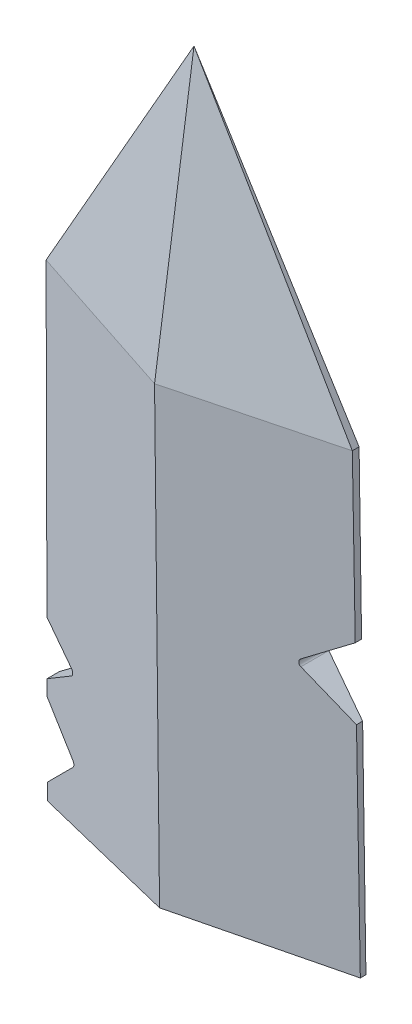
ISO-10303-21;
HEADER;
FILE_DESCRIPTION(('STEP AP214'),'2;1');
FILE_NAME('part.step','',(''),(''),'','','');
FILE_SCHEMA(('AUTOMOTIVE_DESIGN { 1 0 10303 214 1 1 1 1 }'));
ENDSEC;
DATA;
#1=APPLICATION_CONTEXT('core data for automotive mechanical design processes');
#2=APPLICATION_PROTOCOL_DEFINITION('international standard','automotive_design',2000,#1);
#3=PRODUCT_CONTEXT('',#1,'mechanical');
#4=PRODUCT('Part','Part','',(#3));
#5=PRODUCT_RELATED_PRODUCT_CATEGORY('part','',(#4));
#6=PRODUCT_DEFINITION_FORMATION('','',#4);
#7=PRODUCT_DEFINITION_CONTEXT('part definition',#1,'design');
#8=PRODUCT_DEFINITION('design','',#6,#7);
#9=PRODUCT_DEFINITION_SHAPE('','',#8);
#10=(LENGTH_UNIT() NAMED_UNIT(*) SI_UNIT(.MILLI.,.METRE.));
#11=(NAMED_UNIT(*) PLANE_ANGLE_UNIT() SI_UNIT($,.RADIAN.));
#12=(NAMED_UNIT(*) SI_UNIT($,.STERADIAN.) SOLID_ANGLE_UNIT());
#13=UNCERTAINTY_MEASURE_WITH_UNIT(LENGTH_MEASURE(1.E-05),#10,'distance_accuracy_value','');
#14=(GEOMETRIC_REPRESENTATION_CONTEXT(3) GLOBAL_UNCERTAINTY_ASSIGNED_CONTEXT((#13)) GLOBAL_UNIT_ASSIGNED_CONTEXT((#10,
#11,#12)) REPRESENTATION_CONTEXT('',''));
#15=CARTESIAN_POINT('',(0.,0.,0.));
#16=DIRECTION('',(0.,0.,1.));
#17=DIRECTION('',(1.,0.,0.));
#18=AXIS2_PLACEMENT_3D('',#15,#16,#17);
#19=CARTESIAN_POINT('',(49.2246430956603,942.792954579603,0.));
#20=DIRECTION('',(0.238804060374286,0.00264025652948276,0.971064184178478));
#21=DIRECTION('',(0.971067568818316,0.,-0.238804892724763));
#22=AXIS2_PLACEMENT_3D('',#19,#20,#21);
#23=PLANE('',#22);
#24=DIRECTION('',(0.971067568818316,0.,-0.238804892724763));
#25=VECTOR('',#24,1.);
#26=CARTESIAN_POINT('',(49.3765931175051,701.796914098348,0.617884066826339));
#27=LINE('',#26,#25);
#28=CARTESIAN_POINT('',(57.2177665065291,701.796914098348,-1.31041693933411));
#29=VERTEX_POINT('',#28);
#30=CARTESIAN_POINT('',(90.6212496201303,701.796914098348,-9.525));
#31=VERTEX_POINT('',#30);
#32=EDGE_CURVE('E49',#29,#31,#27,.T.);
#33=ORIENTED_EDGE('',*,*,#32,.F.);
#34=DIRECTION('',(0.,0.999996303727557,-0.00271892096670104));
#35=VECTOR('',#34,1.);
#36=CARTESIAN_POINT('',(57.2177665065291,807.125541731836,-1.59679821194385));
#37=LINE('',#36,#35);
#38=CARTESIAN_POINT('',(57.2177665065291,705.432335957503,-1.32030140058543));
#39=VERTEX_POINT('',#38);
#40=EDGE_CURVE('E56',#29,#39,#37,.T.);
#41=ORIENTED_EDGE('',*,*,#40,.T.);
#42=DIRECTION('',(-0.696425219158623,-0.696425219158644,0.173158390613042));
#43=VECTOR('',#42,1.);
#44=CARTESIAN_POINT('',(168.303638707019,816.518208157996,-28.9405689051451));
#45=LINE('',#44,#43);
#46=CARTESIAN_POINT('',(64.8636119693734,713.078181420348,-3.22135589832697));
#47=VERTEX_POINT('',#46);
#48=EDGE_CURVE('E312',#47,#39,#45,.T.);
#49=ORIENTED_EDGE('',*,*,#48,.F.);
#50=CARTESIAN_POINT('',(64.1900927602932,713.751700629428,-3.05755533707624));
#51=DIRECTION('',(0.238804060374286,0.00264025652948276,0.971064184178478));
#52=DIRECTION('',(-0.971004838791762,-0.0107355874174045,0.238818655481073));
#53=AXIS2_PLACEMENT_3D('',#50,#51,#52);
#54=ELLIPSE('',#53,0.980882639396106,0.952500000000012);
#55=CARTESIAN_POINT('',(64.8636119693734,714.425219838508,-3.22501840286267));
#56=VERTEX_POINT('',#55);
#57=EDGE_CURVE('E307',#56,#47,#54,.F.);
#58=ORIENTED_EDGE('',*,*,#57,.F.);
#59=DIRECTION('',(0.696877354228562,-0.696877354228535,-0.169481286066742));
#60=VECTOR('',#59,1.);
#61=CARTESIAN_POINT('',(-54.0162263991512,833.305058207028,25.6866800069781));
#62=LINE('',#61,#60);
#63=CARTESIAN_POINT('',(57.2177665065291,722.071065301352,-1.36554095787541));
#64=VERTEX_POINT('',#63);
#65=EDGE_CURVE('E309',#64,#56,#62,.T.);
#66=ORIENTED_EDGE('',*,*,#65,.F.);
#67=CARTESIAN_POINT('',(57.2177665065291,725.582342683302,-1.37508787885712));
#68=VERTEX_POINT('',#67);
#69=EDGE_CURVE('E230',#64,#68,#37,.T.);
#70=ORIENTED_EDGE('',*,*,#69,.T.);
#71=DIRECTION('',(-0.804607640589238,-0.559330162341017,0.199389854809593));
#72=VECTOR('',#71,1.);
#73=CARTESIAN_POINT('',(149.576215529185,789.786140509004,-24.2624391940651));
#74=LINE('',#73,#72);
#75=CARTESIAN_POINT('',(64.4504287366713,730.610192203076,-3.16741422427782));
#76=VERTEX_POINT('',#75);
#77=EDGE_CURVE('E297',#76,#68,#74,.T.);
#78=ORIENTED_EDGE('',*,*,#77,.F.);
#79=CARTESIAN_POINT('',(63.9067498173311,731.392285217151,-3.03583918590961));
#80=DIRECTION('',(0.238804060374286,0.00264025652948276,0.971064184178478));
#81=DIRECTION('',(-0.971004838791762,-0.0107355874174045,0.238818655481073));
#82=AXIS2_PLACEMENT_3D('',#79,#80,#81);
#83=ELLIPSE('',#82,0.980882639396072,0.952499999999979);
#84=CARTESIAN_POINT('',(64.475710809278,732.156182880221,-3.17783503243639));
#85=VERTEX_POINT('',#84);
#86=EDGE_CURVE('E285',#85,#76,#83,.F.);
#87=ORIENTED_EDGE('',*,*,#86,.F.);
#88=DIRECTION('',(0.787076820241769,-0.58622513202071,-0.19196399043937));
#89=VECTOR('',#88,1.);
#90=CARTESIAN_POINT('',(-42.641006156892,811.938117667513,22.9473815954327));
#91=LINE('',#90,#89);
#92=CARTESIAN_POINT('',(57.2177665065291,737.561994927602,-1.40765972691236));
#93=VERTEX_POINT('',#92);
#94=EDGE_CURVE('E293',#93,#85,#91,.T.);
#95=ORIENTED_EDGE('',*,*,#94,.F.);
#96=CARTESIAN_POINT('',(57.2177665065291,807.103985498089,-1.59673960203131));
#97=VERTEX_POINT('',#96);
#98=EDGE_CURVE('E252',#93,#97,#37,.T.);
#99=ORIENTED_EDGE('',*,*,#98,.T.);
#100=DIRECTION('',(-0.964371981253038,0.117875055876131,0.236837819987201));
#101=VECTOR('',#100,1.);
#102=CARTESIAN_POINT('',(33.9948623465476,809.942517909522,4.10651816773024));
#103=LINE('',#102,#101);
#104=CARTESIAN_POINT('',(89.5005842942128,803.158061078325,-9.52500000000005));
#105=VERTEX_POINT('',#104);
#106=EDGE_CURVE('E268',#105,#97,#103,.T.);
#107=ORIENTED_EDGE('',*,*,#106,.F.);
#108=DIRECTION('',(0.0110554869516549,-0.999938886236685,0.));
#109=VECTOR('',#108,1.);
#110=CARTESIAN_POINT('',(87.9567582020914,942.792954579603,-9.525));
#111=LINE('',#110,#109);
#112=EDGE_CURVE('E257',#105,#31,#111,.T.);
#113=ORIENTED_EDGE('',*,*,#112,.T.);
#114=EDGE_LOOP('',(#33,#41,#49,#58,#66,#70,#78,#87,#95,#99,#107,#113));
#115=FACE_BOUND('',#114,.T.);
#116=ADVANCED_FACE('F33',(#115),#23,.F.);
#117=CARTESIAN_POINT('',(88.8309804853994,863.721914098348,9.525));
#118=DIRECTION('',(0.238804060374286,0.00264025652948278,-0.971064184178478));
#119=DIRECTION('',(-0.971067568818316,0.,-0.238804892724763));
#120=AXIS2_PLACEMENT_3D('',#117,#118,#119);
#121=PLANE('',#120);
#122=DIRECTION('',(-0.971067568818316,0.,-0.238804892724763));
#123=VECTOR('',#122,1.);
#124=CARTESIAN_POINT('',(88.9330755540076,701.796914098348,9.10984430980252));
#125=LINE('',#124,#123);
#126=CARTESIAN_POINT('',(90.6212496201303,701.796914098348,9.52500000000001));
#127=VERTEX_POINT('',#126);
#128=CARTESIAN_POINT('',(57.2177665065291,701.796914098348,1.31041693933411));
#129=VERTEX_POINT('',#128);
#130=EDGE_CURVE('E163',#127,#129,#125,.T.);
#131=ORIENTED_EDGE('',*,*,#130,.F.);
#132=DIRECTION('',(0.0110554869516549,-0.999938886236685,0.));
#133=VECTOR('',#132,1.);
#134=CARTESIAN_POINT('',(88.751463048907,870.914051109623,9.525));
#135=LINE('',#134,#133);
#136=CARTESIAN_POINT('',(89.500584294213,803.158061078325,9.52500000000001));
#137=VERTEX_POINT('',#136);
#138=EDGE_CURVE('E177',#137,#127,#135,.T.);
#139=ORIENTED_EDGE('',*,*,#138,.F.);
#140=DIRECTION('',(0.964371981253038,-0.117875055876131,0.236837819987201));
#141=VECTOR('',#140,1.);
#142=CARTESIAN_POINT('',(57.2177665065292,807.103985498089,1.59673960203132));
#143=LINE('',#142,#141);
#144=CARTESIAN_POINT('',(57.2177665065291,807.103985498089,1.59673960203132));
#145=VERTEX_POINT('',#144);
#146=EDGE_CURVE('E246',#145,#137,#143,.T.);
#147=ORIENTED_EDGE('',*,*,#146,.F.);
#148=DIRECTION('',(0.,-0.999996303727557,-0.00271892096670106));
#149=VECTOR('',#148,1.);
#150=CARTESIAN_POINT('',(57.2177665065291,807.073746478871,1.59665738422406));
#151=LINE('',#150,#149);
#152=CARTESIAN_POINT('',(57.2177665065291,737.561994927602,1.40765972691236));
#153=VERTEX_POINT('',#152);
#154=EDGE_CURVE('E239',#145,#153,#151,.T.);
#155=ORIENTED_EDGE('',*,*,#154,.T.);
#156=DIRECTION('',(-0.787076820241769,0.58622513202071,-0.19196399043937));
#157=VECTOR('',#156,1.);
#158=CARTESIAN_POINT('',(19.8175679838206,765.418152995935,-7.71405643471774));
#159=LINE('',#158,#157);
#160=CARTESIAN_POINT('',(64.475710809278,732.156182880221,3.1778350324364));
#161=VERTEX_POINT('',#160);
#162=EDGE_CURVE('E295',#161,#153,#159,.T.);
#163=ORIENTED_EDGE('',*,*,#162,.F.);
#164=CARTESIAN_POINT('',(63.9067498173311,731.392285217151,3.03583918590962));
#165=DIRECTION('',(0.238804060374286,0.00264025652948278,-0.971064184178478));
#166=DIRECTION('',(0.971004838791762,0.0107355874174046,0.238818655481073));
#167=AXIS2_PLACEMENT_3D('',#164,#165,#166);
#168=ELLIPSE('',#167,0.980882639396072,0.952499999999979);
#169=CARTESIAN_POINT('',(64.4504287366713,730.610192203076,3.16741422427781));
#170=VERTEX_POINT('',#169);
#171=EDGE_CURVE('E218',#170,#161,#168,.F.);
#172=ORIENTED_EDGE('',*,*,#171,.F.);
#173=DIRECTION('',(0.804607640589238,0.559330162341017,0.199389854809593));
#174=VECTOR('',#173,1.);
#175=CARTESIAN_POINT('',(141.159965006135,783.935509053512,22.1768077817121));
#176=LINE('',#175,#174);
#177=CARTESIAN_POINT('',(57.2177665065291,725.582342683302,1.37508787885712));
#178=VERTEX_POINT('',#177);
#179=EDGE_CURVE('E238',#178,#170,#176,.T.);
#180=ORIENTED_EDGE('',*,*,#179,.F.);
#181=CARTESIAN_POINT('',(57.2177665065291,722.071065301352,1.36554095787542));
#182=VERTEX_POINT('',#181);
#183=EDGE_CURVE('E229',#178,#182,#151,.T.);
#184=ORIENTED_EDGE('',*,*,#183,.T.);
#185=DIRECTION('',(-0.696877354228562,0.696877354228535,-0.169481286066742));
#186=VECTOR('',#185,1.);
#187=CARTESIAN_POINT('',(4.74299915270349,774.545832655176,-11.3963761904074));
#188=LINE('',#187,#186);
#189=CARTESIAN_POINT('',(64.8636119693734,714.425219838508,3.22501840286268));
#190=VERTEX_POINT('',#189);
#191=EDGE_CURVE('E236',#190,#182,#188,.T.);
#192=ORIENTED_EDGE('',*,*,#191,.F.);
#193=CARTESIAN_POINT('',(64.1900927602932,713.751700629428,3.05755533707625));
#194=DIRECTION('',(0.238804060374286,0.00264025652948278,-0.971064184178478));
#195=DIRECTION('',(0.971004838791762,0.0107355874174046,0.238818655481073));
#196=AXIS2_PLACEMENT_3D('',#193,#194,#195);
#197=ELLIPSE('',#196,0.980882639396106,0.952500000000012);
#198=CARTESIAN_POINT('',(64.8636119693734,713.078181420348,3.22135589832697));
#199=VERTEX_POINT('',#198);
#200=EDGE_CURVE('E11',#199,#190,#197,.F.);
#201=ORIENTED_EDGE('',*,*,#200,.F.);
#202=DIRECTION('',(0.696425219158623,0.696425219158644,0.173158390613042));
#203=VECTOR('',#202,1.);
#204=CARTESIAN_POINT('',(150.311576163779,798.526145614756,24.4670425191242));
#205=LINE('',#204,#203);
#206=CARTESIAN_POINT('',(57.2177665065291,705.432335957503,1.32030140058543));
#207=VERTEX_POINT('',#206);
#208=EDGE_CURVE('E314',#207,#199,#205,.T.);
#209=ORIENTED_EDGE('',*,*,#208,.F.);
#210=EDGE_CURVE('E181',#207,#129,#151,.T.);
#211=ORIENTED_EDGE('',*,*,#210,.T.);
#212=EDGE_LOOP('',(#131,#139,#147,#155,#163,#172,#180,#184,#192,#201,#209,#211));
#213=FACE_BOUND('',#212,.T.);
#214=ADVANCED_FACE('F175',(#213),#121,.F.);
#215=CARTESIAN_POINT('',(57.2177665065291,807.103985498089,-9.525));
#216=DIRECTION('',(-1.,0.,0.));
#217=DIRECTION('',(0.,0.,1.));
#218=AXIS2_PLACEMENT_3D('',#215,#216,#217);
#219=PLANE('',#218);
#220=ORIENTED_EDGE('',*,*,#40,.F.);
#221=DIRECTION('',(0.,0.,1.));
#222=VECTOR('',#221,1.);
#223=CARTESIAN_POINT('',(57.2177665065291,701.796914098348,-9.525));
#224=LINE('',#223,#222);
#225=EDGE_CURVE('E170',#29,#129,#224,.T.);
#226=ORIENTED_EDGE('',*,*,#225,.T.);
#227=ORIENTED_EDGE('',*,*,#210,.F.);
#228=DIRECTION('',(0.,0.,-1.));
#229=VECTOR('',#228,1.);
#230=CARTESIAN_POINT('',(57.2177665065291,705.432335957503,-9.525));
#231=LINE('',#230,#229);
#232=EDGE_CURVE('E220',#207,#39,#231,.T.);
#233=ORIENTED_EDGE('',*,*,#232,.T.);
#234=EDGE_LOOP('',(#220,#226,#227,#233));
#235=FACE_BOUND('',#234,.T.);
#236=ADVANCED_FACE('F382',(#235),#219,.T.);
#237=CARTESIAN_POINT('',(134.681996719391,219.836565958458,-9.525));
#238=DIRECTION('',(0.999866416510167,0.0163446974617832,0.));
#239=DIRECTION('',(-0.0163446974617832,0.999866416510167,0.));
#240=AXIS2_PLACEMENT_3D('',#237,#238,#239);
#241=PLANE('',#240);
#242=DIRECTION('',(-0.0163446836309879,0.999865570428571,0.00130091834944232));
#243=VECTOR('',#242,1.);
#244=CARTESIAN_POINT('',(134.682199250408,219.824176376929,-1.61200009608092E-05));
#245=LINE('',#244,#243);
#246=CARTESIAN_POINT('',(126.803448196463,701.796914098348,0.627075358070428));
#247=VERTEX_POINT('',#246);
#248=CARTESIAN_POINT('',(126.004357543198,750.680284978387,0.690677182196816));
#249=VERTEX_POINT('',#248);
#250=EDGE_CURVE('E190',#247,#249,#245,.T.);
#251=ORIENTED_EDGE('',*,*,#250,.F.);
#252=DIRECTION('',(0.,0.,-1.));
#253=VECTOR('',#252,1.);
#254=CARTESIAN_POINT('',(126.803448196463,701.796914098348,-9.525));
#255=LINE('',#254,#253);
#256=CARTESIAN_POINT('',(126.803448196463,701.796914098348,-0.627075358070433));
#257=VERTEX_POINT('',#256);
#258=EDGE_CURVE('E166',#247,#257,#255,.T.);
#259=ORIENTED_EDGE('',*,*,#258,.T.);
#260=DIRECTION('',(0.0163446836309879,-0.999865570428571,0.00130091834944232));
#261=VECTOR('',#260,1.);
#262=CARTESIAN_POINT('',(134.681794188375,219.848955539986,-1.61200009590745E-05));
#263=LINE('',#262,#261);
#264=CARTESIAN_POINT('',(126.004357543198,750.680284978387,-0.690677182196826));
#265=VERTEX_POINT('',#264);
#266=EDGE_CURVE('E256',#265,#257,#263,.T.);
#267=ORIENTED_EDGE('',*,*,#266,.F.);
#268=DIRECTION('',(0.,0.,1.));
#269=VECTOR('',#268,1.);
#270=CARTESIAN_POINT('',(126.004357543198,750.680284978387,-9.52500000000005));
#271=LINE('',#270,#269);
#272=EDGE_CURVE('E284',#265,#249,#271,.T.);
#273=ORIENTED_EDGE('',*,*,#272,.T.);
#274=EDGE_LOOP('',(#251,#259,#267,#273));
#275=FACE_BOUND('',#274,.T.);
#276=ADVANCED_FACE('F400',(#275),#241,.T.);
#277=CARTESIAN_POINT('',(88.751463048907,870.914051109623,9.525));
#278=DIRECTION('',(-0.238804060374287,-0.00264025652948276,-0.971064184178478));
#279=DIRECTION('',(-0.971067568818316,0.,0.238804892724763));
#280=AXIS2_PLACEMENT_3D('',#277,#278,#279);
#281=PLANE('',#280);
#282=DIRECTION('',(-0.971067568818316,0.,0.238804892724763));
#283=VECTOR('',#282,1.);
#284=CARTESIAN_POINT('',(88.8580928201343,701.796914098348,9.95859544072959));
#285=LINE('',#284,#283);
#286=EDGE_CURVE('E160',#247,#127,#285,.T.);
#287=ORIENTED_EDGE('',*,*,#286,.F.);
#288=ORIENTED_EDGE('',*,*,#250,.T.);
#289=DIRECTION('',(-0.787076820241769,0.586225132020711,0.19196399043937));
#290=VECTOR('',#289,1.);
#291=CARTESIAN_POINT('',(46.1154172249093,810.182614840798,20.1751790517357));
#292=LINE('',#291,#290);
#293=CARTESIAN_POINT('',(115.966414800608,758.156676301515,3.13887981644233));
#294=VERTEX_POINT('',#293);
#295=EDGE_CURVE('E277',#249,#294,#292,.T.);
#296=ORIENTED_EDGE('',*,*,#295,.T.);
#297=CARTESIAN_POINT('',(116.535375792555,758.920573964585,2.99688396991557));
#298=DIRECTION('',(-0.238804060374287,-0.00264025652948276,-0.971064184178478));
#299=DIRECTION('',(-0.971004838791762,-0.0107355874174045,0.238818655481073));
#300=AXIS2_PLACEMENT_3D('',#297,#298,#299);
#301=ELLIPSE('',#300,0.980882639396002,0.952499999999911);
#302=CARTESIAN_POINT('',(115.991696873215,759.70266697866,3.12845900828372));
#303=VERTEX_POINT('',#302);
#304=EDGE_CURVE('E271',#294,#303,#301,.T.);
#305=ORIENTED_EDGE('',*,*,#304,.T.);
#306=DIRECTION('',(0.804607640589238,0.559330162341017,-0.199389854809593));
#307=VECTOR('',#306,1.);
#308=CARTESIAN_POINT('',(147.380065222877,781.522570592524,-4.64989393323915));
#309=LINE('',#308,#307);
#310=CARTESIAN_POINT('',(125.746024678191,766.483474765532,0.711238605834009));
#311=VERTEX_POINT('',#310);
#312=EDGE_CURVE('E274',#303,#311,#309,.T.);
#313=ORIENTED_EDGE('',*,*,#312,.T.);
#314=CARTESIAN_POINT('',(125.140068316515,803.552097009916,0.759468340202815));
#315=VERTEX_POINT('',#314);
#316=EDGE_CURVE('E187',#311,#315,#245,.T.);
#317=ORIENTED_EDGE('',*,*,#316,.T.);
#318=DIRECTION('',(-0.971004838791762,-0.0107355874174043,0.238818655481073));
#319=VECTOR('',#318,1.);
#320=CARTESIAN_POINT('',(263.411960266397,805.080853535213,-33.2485056750293));
#321=LINE('',#320,#319);
#322=EDGE_CURVE('E186',#315,#137,#321,.T.);
#323=ORIENTED_EDGE('',*,*,#322,.T.);
#324=ORIENTED_EDGE('',*,*,#138,.T.);
#325=EDGE_LOOP('',(#287,#288,#296,#305,#313,#317,#323,#324));
#326=FACE_BOUND('',#325,.T.);
#327=ADVANCED_FACE('F184',(#326),#281,.F.);
#328=CARTESIAN_POINT('',(87.9567582020914,942.792954579603,-9.525));
#329=DIRECTION('',(-0.238804060374286,-0.00264025652948276,0.971064184178478));
#330=DIRECTION('',(0.971067568818316,0.,0.238804892724763));
#331=AXIS2_PLACEMENT_3D('',#328,#329,#330);
#332=PLANE('',#331);
#333=DIRECTION('',(0.971067568818316,0.,0.238804892724763));
#334=VECTOR('',#333,1.);
#335=CARTESIAN_POINT('',(88.1087082239363,701.796914098348,-10.1428840668263));
#336=LINE('',#335,#334);
#337=EDGE_CURVE('E327',#31,#257,#336,.T.);
#338=ORIENTED_EDGE('',*,*,#337,.F.);
#339=ORIENTED_EDGE('',*,*,#112,.F.);
#340=DIRECTION('',(-0.971004838791762,-0.0107355874174104,-0.238818655481073));
#341=VECTOR('',#340,1.);
#342=CARTESIAN_POINT('',(253.730114986282,804.973809479187,30.8672556750294));
#343=LINE('',#342,#341);
#344=CARTESIAN_POINT('',(125.140068316515,803.552097009916,-0.759468340202823));
#345=VERTEX_POINT('',#344);
#346=EDGE_CURVE('E262',#345,#105,#343,.T.);
#347=ORIENTED_EDGE('',*,*,#346,.F.);
#348=CARTESIAN_POINT('',(125.746024678191,766.483474765532,-0.711238605834015));
#349=VERTEX_POINT('',#348);
#350=EDGE_CURVE('E253',#345,#349,#263,.T.);
#351=ORIENTED_EDGE('',*,*,#350,.T.);
#352=DIRECTION('',(-0.804607640589239,-0.559330162341017,-0.199389854809593));
#353=VECTOR('',#352,1.);
#354=CARTESIAN_POINT('',(179.214055264345,803.652252091468,12.5386764058117));
#355=LINE('',#354,#353);
#356=CARTESIAN_POINT('',(115.991696873215,759.70266697866,-3.12845900828373));
#357=VERTEX_POINT('',#356);
#358=EDGE_CURVE('E209',#349,#357,#355,.T.);
#359=ORIENTED_EDGE('',*,*,#358,.T.);
#360=CARTESIAN_POINT('',(116.535375792555,758.920573964585,-2.99688396991558));
#361=DIRECTION('',(-0.238804060374286,-0.00264025652948276,0.971064184178478));
#362=DIRECTION('',(0.971004838791762,0.0107355874174045,0.238818655481073));
#363=AXIS2_PLACEMENT_3D('',#360,#361,#362);
#364=ELLIPSE('',#363,0.980882639396002,0.952499999999911);
#365=CARTESIAN_POINT('',(115.966414800608,758.156676301515,-3.13887981644234));
#366=VERTEX_POINT('',#365);
#367=EDGE_CURVE('E206',#357,#366,#364,.T.);
#368=ORIENTED_EDGE('',*,*,#367,.T.);
#369=DIRECTION('',(0.787076820241769,-0.586225132020711,0.19196399043937));
#370=VECTOR('',#369,1.);
#371=CARTESIAN_POINT('',(12.4578767056008,835.251192172758,-28.3840801657039));
#372=LINE('',#371,#370);
#373=EDGE_CURVE('E203',#366,#265,#372,.T.);
#374=ORIENTED_EDGE('',*,*,#373,.T.);
#375=ORIENTED_EDGE('',*,*,#266,.T.);
#376=EDGE_LOOP('',(#338,#339,#347,#351,#359,#368,#374,#375));
#377=FACE_BOUND('',#376,.T.);
#378=ADVANCED_FACE('F386',(#377),#332,.F.);
#379=ORIENTED_EDGE('',*,*,#69,.F.);
#380=DIRECTION('',(0.,0.,1.));
#381=VECTOR('',#380,1.);
#382=CARTESIAN_POINT('',(57.2177665065291,722.071065301352,-9.525));
#383=LINE('',#382,#381);
#384=EDGE_CURVE('E42',#64,#182,#383,.T.);
#385=ORIENTED_EDGE('',*,*,#384,.T.);
#386=ORIENTED_EDGE('',*,*,#183,.F.);
#387=DIRECTION('',(0.,0.,-1.));
#388=VECTOR('',#387,1.);
#389=CARTESIAN_POINT('',(57.2177665065291,725.582342683302,-9.525));
#390=LINE('',#389,#388);
#391=EDGE_CURVE('E212',#178,#68,#390,.T.);
#392=ORIENTED_EDGE('',*,*,#391,.T.);
#393=EDGE_LOOP('',(#379,#385,#386,#392));
#394=FACE_BOUND('',#393,.T.);
#395=ADVANCED_FACE('F228',(#394),#219,.T.);
#396=ORIENTED_EDGE('',*,*,#98,.F.);
#397=DIRECTION('',(0.,0.,1.));
#398=VECTOR('',#397,1.);
#399=CARTESIAN_POINT('',(57.2177665065291,737.561994927602,-9.525));
#400=LINE('',#399,#398);
#401=EDGE_CURVE('E215',#93,#153,#400,.T.);
#402=ORIENTED_EDGE('',*,*,#401,.T.);
#403=ORIENTED_EDGE('',*,*,#154,.F.);
#404=DIRECTION('',(0.,0.,1.));
#405=VECTOR('',#404,1.);
#406=CARTESIAN_POINT('',(57.2177665065291,807.103985498089,-9.525));
#407=LINE('',#406,#405);
#408=EDGE_CURVE('E197',#97,#145,#407,.T.);
#409=ORIENTED_EDGE('',*,*,#408,.F.);
#410=EDGE_LOOP('',(#396,#402,#403,#409));
#411=FACE_BOUND('',#410,.T.);
#412=ADVANCED_FACE('F35',(#411),#219,.T.);
#413=DIRECTION('',(0.,0.,1.));
#414=VECTOR('',#413,1.);
#415=CARTESIAN_POINT('',(125.746024678191,766.483474765532,-9.52500000000005));
#416=LINE('',#415,#414);
#417=EDGE_CURVE('E288',#349,#311,#416,.T.);
#418=ORIENTED_EDGE('',*,*,#417,.F.);
#419=ORIENTED_EDGE('',*,*,#350,.F.);
#420=DIRECTION('',(0.,0.,1.));
#421=VECTOR('',#420,1.);
#422=CARTESIAN_POINT('',(125.140068316515,803.552097009916,-9.525));
#423=LINE('',#422,#421);
#424=EDGE_CURVE('E196',#345,#315,#423,.T.);
#425=ORIENTED_EDGE('',*,*,#424,.T.);
#426=ORIENTED_EDGE('',*,*,#316,.F.);
#427=EDGE_LOOP('',(#418,#419,#425,#426));
#428=FACE_BOUND('',#427,.T.);
#429=ADVANCED_FACE('F405',(#428),#241,.T.);
#430=CARTESIAN_POINT('',(88.8309804853994,863.721914098348,-9.525));
#431=DIRECTION('',(-0.873115591987121,0.487513243952386,0.));
#432=DIRECTION('',(-0.487513243952386,-0.873115591987121,0.));
#433=AXIS2_PLACEMENT_3D('',#430,#431,#432);
#434=PLANE('',#433);
#435=DIRECTION('',(0.487365515987827,0.872851017453344,-0.0246161564136531));
#436=VECTOR('',#435,1.);
#437=CARTESIAN_POINT('',(88.9452525368794,863.926570507406,-0.00577172286638297));
#438=LINE('',#437,#436);
#439=CARTESIAN_POINT('',(88.830980485398,863.721914098348,-3.35235311732518E-13));
#440=VERTEX_POINT('',#439);
#441=EDGE_CURVE('E242',#145,#440,#438,.T.);
#442=ORIENTED_EDGE('',*,*,#441,.T.);
#443=DIRECTION('',(-0.487365515987827,-0.872851017453344,-0.0246161564136429));
#444=VECTOR('',#443,1.);
#445=CARTESIAN_POINT('',(88.7167084339195,863.51725768929,-0.00577172286722952));
#446=LINE('',#445,#444);
#447=EDGE_CURVE('E265',#440,#97,#446,.T.);
#448=ORIENTED_EDGE('',*,*,#447,.T.);
#449=ORIENTED_EDGE('',*,*,#408,.T.);
#450=EDGE_LOOP('',(#442,#448,#449));
#451=FACE_BOUND('',#450,.T.);
#452=ADVANCED_FACE('F401',(#451),#434,.T.);
#453=CARTESIAN_POINT('',(253.060511177469,865.53766249921,40.3922556750294));
#454=DIRECTION('',(-0.234398315242398,-0.153562533675178,0.959935403067719));
#455=DIRECTION('',(0.971457931993895,0.,0.237211901822283));
#456=AXIS2_PLACEMENT_3D('',#453,#454,#455);
#457=PLANE('',#456);
#458=DIRECTION('',(0.0109212623522735,-0.987798634339821,-0.155353094674737));
#459=VECTOR('',#458,1.);
#460=CARTESIAN_POINT('',(88.7624488878927,869.920411693328,0.974850288548136));
#461=LINE('',#460,#459);
#462=EDGE_CURVE('E199',#440,#105,#461,.T.);
#463=ORIENTED_EDGE('',*,*,#462,.F.);
#464=DIRECTION('',(0.516631832159413,-0.85613945984216,-0.0108062621096695));
#465=VECTOR('',#464,1.);
#466=CARTESIAN_POINT('',(125.189005043767,803.471001226367,-0.760491937798964));
#467=LINE('',#466,#465);
#468=EDGE_CURVE('E260',#440,#345,#467,.T.);
#469=ORIENTED_EDGE('',*,*,#468,.T.);
#470=ORIENTED_EDGE('',*,*,#346,.T.);
#471=EDGE_LOOP('',(#463,#469,#470));
#472=FACE_BOUND('',#471,.T.);
#473=ADVANCED_FACE('F404',(#472),#457,.F.);
#474=CARTESIAN_POINT('',(125.140068316515,803.552097009916,-9.525));
#475=DIRECTION('',(0.856189452192074,0.516661999720355,0.));
#476=DIRECTION('',(-0.516661999720355,0.856189452192074,0.));
#477=AXIS2_PLACEMENT_3D('',#474,#475,#476);
#478=PLANE('',#477);
#479=ORIENTED_EDGE('',*,*,#468,.F.);
#480=DIRECTION('',(-0.516631832159413,0.85613945984216,-0.010806262109669));
#481=VECTOR('',#480,1.);
#482=CARTESIAN_POINT('',(125.082651579959,803.647245490442,0.758267368318995));
#483=LINE('',#482,#481);
#484=EDGE_CURVE('E188',#315,#440,#483,.T.);
#485=ORIENTED_EDGE('',*,*,#484,.F.);
#486=ORIENTED_EDGE('',*,*,#424,.F.);
#487=EDGE_LOOP('',(#479,#485,#486));
#488=FACE_BOUND('',#487,.T.);
#489=ADVANCED_FACE('F396',(#488),#478,.T.);
#490=CARTESIAN_POINT('',(263.411960266397,805.080853535213,-33.2485056750293));
#491=DIRECTION('',(-0.234398315242399,-0.153562533675178,-0.959935403067719));
#492=DIRECTION('',(-0.971457931993895,0.,0.237211901822284));
#493=AXIS2_PLACEMENT_3D('',#490,#491,#492);
#494=PLANE('',#493);
#495=ORIENTED_EDGE('',*,*,#484,.T.);
#496=DIRECTION('',(0.0109212623522489,-0.98779863433982,0.155353094674742));
#497=VECTOR('',#496,1.);
#498=CARTESIAN_POINT('',(88.8309804853995,863.721914098348,0.));
#499=LINE('',#498,#497);
#500=EDGE_CURVE('E248',#440,#137,#499,.T.);
#501=ORIENTED_EDGE('',*,*,#500,.T.);
#502=ORIENTED_EDGE('',*,*,#322,.F.);
#503=EDGE_LOOP('',(#495,#501,#502));
#504=FACE_BOUND('',#503,.T.);
#505=ADVANCED_FACE('F391',(#504),#494,.F.);
#506=CARTESIAN_POINT('',(56.5481626977157,867.667838518112,-7.92826039796866));
#507=DIRECTION('',(-0.218586785861508,0.149246460882491,0.964336720736479));
#508=DIRECTION('',(0.975259601687497,0.,0.22106268187178));
#509=AXIS2_PLACEMENT_3D('',#506,#507,#508);
#510=PLANE('',#509);
#511=ORIENTED_EDGE('',*,*,#146,.T.);
#512=ORIENTED_EDGE('',*,*,#500,.F.);
#513=ORIENTED_EDGE('',*,*,#441,.F.);
#514=EDGE_LOOP('',(#511,#512,#513));
#515=FACE_BOUND('',#514,.T.);
#516=ADVANCED_FACE('F388',(#515),#510,.T.);
#517=CARTESIAN_POINT('',(-23.9331022358085,16.3410189346765,-105.585382191186));
#518=DIRECTION('',(-0.218586785861509,0.149246460882481,-0.964336720736481));
#519=DIRECTION('',(-0.975259601687497,0.,0.221062681871782));
#520=AXIS2_PLACEMENT_3D('',#517,#518,#519);
#521=PLANE('',#520);
#522=ORIENTED_EDGE('',*,*,#462,.T.);
#523=ORIENTED_EDGE('',*,*,#106,.T.);
#524=ORIENTED_EDGE('',*,*,#447,.F.);
#525=EDGE_LOOP('',(#522,#523,#524));
#526=FACE_BOUND('',#525,.T.);
#527=ADVANCED_FACE('F390',(#526),#521,.T.);
#528=CARTESIAN_POINT('',(116.535375792555,758.920573964585,-9.52500000000005));
#529=DIRECTION('',(0.,0.,1.));
#530=DIRECTION('',(1.,0.,0.));
#531=AXIS2_PLACEMENT_3D('',#528,#529,#530);
#532=CYLINDRICAL_SURFACE('',#531,0.952499999999911);
#533=DIRECTION('',(0.,0.,1.));
#534=VECTOR('',#533,1.);
#535=CARTESIAN_POINT('',(115.966414800608,758.156676301515,-9.52500000000005));
#536=LINE('',#535,#534);
#537=EDGE_CURVE('E281',#366,#294,#536,.T.);
#538=ORIENTED_EDGE('',*,*,#537,.F.);
#539=ORIENTED_EDGE('',*,*,#367,.F.);
#540=DIRECTION('',(0.,0.,1.));
#541=VECTOR('',#540,1.);
#542=CARTESIAN_POINT('',(115.991696873215,759.70266697866,-9.52500000000005));
#543=LINE('',#542,#541);
#544=EDGE_CURVE('E280',#357,#303,#543,.T.);
#545=ORIENTED_EDGE('',*,*,#544,.T.);
#546=ORIENTED_EDGE('',*,*,#304,.F.);
#547=EDGE_LOOP('',(#538,#539,#545,#546));
#548=FACE_BOUND('',#547,.T.);
#549=ADVANCED_FACE('F468',(#548),#532,.F.);
#550=CARTESIAN_POINT('',(125.746024678191,766.483474765532,-9.52500000000005));
#551=DIRECTION('',(-0.570791516367642,0.821095027900381,0.));
#552=DIRECTION('',(-0.821095027900381,-0.570791516367642,0.));
#553=AXIS2_PLACEMENT_3D('',#550,#551,#552);
#554=PLANE('',#553);
#555=ORIENTED_EDGE('',*,*,#544,.F.);
#556=ORIENTED_EDGE('',*,*,#358,.F.);
#557=ORIENTED_EDGE('',*,*,#417,.T.);
#558=ORIENTED_EDGE('',*,*,#312,.F.);
#559=EDGE_LOOP('',(#555,#556,#557,#558));
#560=FACE_BOUND('',#559,.T.);
#561=ADVANCED_FACE('F464',(#560),#554,.F.);
#562=CARTESIAN_POINT('',(115.966414800608,758.156676301515,-9.52500000000005));
#563=DIRECTION('',(-0.597334374747374,-0.80199229718568,0.));
#564=DIRECTION('',(0.80199229718568,-0.597334374747374,0.));
#565=AXIS2_PLACEMENT_3D('',#562,#563,#564);
#566=PLANE('',#565);
#567=ORIENTED_EDGE('',*,*,#272,.F.);
#568=ORIENTED_EDGE('',*,*,#373,.F.);
#569=ORIENTED_EDGE('',*,*,#537,.T.);
#570=ORIENTED_EDGE('',*,*,#295,.F.);
#571=EDGE_LOOP('',(#567,#568,#569,#570));
#572=FACE_BOUND('',#571,.T.);
#573=ADVANCED_FACE('F467',(#572),#566,.F.);
#574=CARTESIAN_POINT('',(63.9067498173311,731.392285217151,-9.52500000000005));
#575=DIRECTION('',(0.,0.,1.));
#576=DIRECTION('',(1.,0.,0.));
#577=AXIS2_PLACEMENT_3D('',#574,#575,#576);
#578=CYLINDRICAL_SURFACE('',#577,0.952499999999979);
#579=ORIENTED_EDGE('',*,*,#86,.T.);
#580=DIRECTION('',(0.,0.,1.));
#581=VECTOR('',#580,1.);
#582=CARTESIAN_POINT('',(64.4504287366713,730.610192203076,-9.52500000000005));
#583=LINE('',#582,#581);
#584=EDGE_CURVE('E301',#76,#170,#583,.T.);
#585=ORIENTED_EDGE('',*,*,#584,.T.);
#586=ORIENTED_EDGE('',*,*,#171,.T.);
#587=DIRECTION('',(0.,0.,1.));
#588=VECTOR('',#587,1.);
#589=CARTESIAN_POINT('',(64.475710809278,732.156182880221,-9.52500000000005));
#590=LINE('',#589,#588);
#591=EDGE_CURVE('E304',#85,#161,#590,.T.);
#592=ORIENTED_EDGE('',*,*,#591,.F.);
#593=EDGE_LOOP('',(#579,#585,#586,#592));
#594=FACE_BOUND('',#593,.T.);
#595=ADVANCED_FACE('F446',(#594),#578,.F.);
#596=CARTESIAN_POINT('',(57.2177665065291,737.561994927602,-9.52500000000005));
#597=DIRECTION('',(-0.597334374747374,-0.80199229718568,0.));
#598=DIRECTION('',(0.80199229718568,-0.597334374747374,0.));
#599=AXIS2_PLACEMENT_3D('',#596,#597,#598);
#600=PLANE('',#599);
#601=ORIENTED_EDGE('',*,*,#94,.T.);
#602=ORIENTED_EDGE('',*,*,#591,.T.);
#603=ORIENTED_EDGE('',*,*,#162,.T.);
#604=ORIENTED_EDGE('',*,*,#401,.F.);
#605=EDGE_LOOP('',(#601,#602,#603,#604));
#606=FACE_BOUND('',#605,.T.);
#607=ADVANCED_FACE('F441',(#606),#600,.T.);
#608=CARTESIAN_POINT('',(64.4504287366713,730.610192203076,-9.52500000000005));
#609=DIRECTION('',(-0.570791516367642,0.821095027900381,0.));
#610=DIRECTION('',(-0.821095027900381,-0.570791516367642,0.));
#611=AXIS2_PLACEMENT_3D('',#608,#609,#610);
#612=PLANE('',#611);
#613=ORIENTED_EDGE('',*,*,#77,.T.);
#614=ORIENTED_EDGE('',*,*,#391,.F.);
#615=ORIENTED_EDGE('',*,*,#179,.T.);
#616=ORIENTED_EDGE('',*,*,#584,.F.);
#617=EDGE_LOOP('',(#613,#614,#615,#616));
#618=FACE_BOUND('',#617,.T.);
#619=ADVANCED_FACE('F450',(#618),#612,.T.);
#620=CARTESIAN_POINT('',(64.1900927602932,713.751700629428,-9.52500000000005));
#621=DIRECTION('',(0.,0.,1.));
#622=DIRECTION('',(1.,0.,0.));
#623=AXIS2_PLACEMENT_3D('',#620,#621,#622);
#624=CYLINDRICAL_SURFACE('',#623,0.952500000000012);
#625=ORIENTED_EDGE('',*,*,#57,.T.);
#626=DIRECTION('',(0.,0.,1.));
#627=VECTOR('',#626,1.);
#628=CARTESIAN_POINT('',(64.8636119693734,713.078181420348,-9.52500000000005));
#629=LINE('',#628,#627);
#630=EDGE_CURVE('E316',#47,#199,#629,.T.);
#631=ORIENTED_EDGE('',*,*,#630,.T.);
#632=ORIENTED_EDGE('',*,*,#200,.T.);
#633=DIRECTION('',(0.,0.,1.));
#634=VECTOR('',#633,1.);
#635=CARTESIAN_POINT('',(64.8636119693734,714.425219838508,-9.52500000000005));
#636=LINE('',#635,#634);
#637=EDGE_CURVE('E319',#56,#190,#636,.T.);
#638=ORIENTED_EDGE('',*,*,#637,.F.);
#639=EDGE_LOOP('',(#625,#631,#632,#638));
#640=FACE_BOUND('',#639,.T.);
#641=ADVANCED_FACE('F452',(#640),#624,.F.);
#642=CARTESIAN_POINT('',(57.2177665065291,722.071065301352,-9.52500000000005));
#643=DIRECTION('',(-0.707106781186534,-0.707106781186561,0.));
#644=DIRECTION('',(0.707106781186561,-0.707106781186534,0.));
#645=AXIS2_PLACEMENT_3D('',#642,#643,#644);
#646=PLANE('',#645);
#647=ORIENTED_EDGE('',*,*,#65,.T.);
#648=ORIENTED_EDGE('',*,*,#637,.T.);
#649=ORIENTED_EDGE('',*,*,#191,.T.);
#650=ORIENTED_EDGE('',*,*,#384,.F.);
#651=EDGE_LOOP('',(#647,#648,#649,#650));
#652=FACE_BOUND('',#651,.T.);
#653=ADVANCED_FACE('F458',(#652),#646,.T.);
#654=CARTESIAN_POINT('',(64.8636119693734,713.078181420348,-9.52500000000005));
#655=DIRECTION('',(-0.707106781186558,0.707106781186537,0.));
#656=DIRECTION('',(-0.707106781186537,-0.707106781186558,0.));
#657=AXIS2_PLACEMENT_3D('',#654,#655,#656);
#658=PLANE('',#657);
#659=ORIENTED_EDGE('',*,*,#48,.T.);
#660=ORIENTED_EDGE('',*,*,#232,.F.);
#661=ORIENTED_EDGE('',*,*,#208,.T.);
#662=ORIENTED_EDGE('',*,*,#630,.F.);
#663=EDGE_LOOP('',(#659,#660,#661,#662));
#664=FACE_BOUND('',#663,.T.);
#665=ADVANCED_FACE('F354',(#664),#658,.T.);
#666=CARTESIAN_POINT('',(0.,701.796914098348,-9.52500000000005));
#667=DIRECTION('',(0.,-1.,0.));
#668=DIRECTION('',(0.,0.,-1.));
#669=AXIS2_PLACEMENT_3D('',#666,#667,#668);
#670=PLANE('',#669);
#671=CARTESIAN_POINT('',(108.64988161296,701.796914098348,0.));
#672=DIRECTION('',(0.,-1.,0.));
#673=DIRECTION('',(0.,0.,-1.));
#674=AXIS2_PLACEMENT_3D('',#671,#672,#673);
#675=CIRCLE('',#674,1.5875);
#676=CARTESIAN_POINT('',(108.64988161296,701.796914098348,-1.5875));
#677=VERTEX_POINT('',#676);
#678=EDGE_CURVE('E336',#677,#677,#675,.T.);
#679=ORIENTED_EDGE('',*,*,#678,.F.);
#680=EDGE_LOOP('',(#679));
#681=FACE_BOUND('',#680,.T.);
#682=CARTESIAN_POINT('',(83.2498816129603,701.796914098348,0.));
#683=DIRECTION('',(0.,-1.,0.));
#684=DIRECTION('',(0.,0.,-1.));
#685=AXIS2_PLACEMENT_3D('',#682,#683,#684);
#686=CIRCLE('',#685,1.5875);
#687=CARTESIAN_POINT('',(83.2498816129603,701.796914098348,-1.5875));
#688=VERTEX_POINT('',#687);
#689=EDGE_CURVE('E329',#688,#688,#686,.T.);
#690=ORIENTED_EDGE('',*,*,#689,.F.);
#691=EDGE_LOOP('',(#690));
#692=FACE_BOUND('',#691,.T.);
#693=CARTESIAN_POINT('',(95.9498816129603,701.796914098348,0.));
#694=DIRECTION('',(0.,-1.,0.));
#695=DIRECTION('',(0.,0.,-1.));
#696=AXIS2_PLACEMENT_3D('',#693,#694,#695);
#697=CIRCLE('',#696,3.175);
#698=CARTESIAN_POINT('',(95.9498816129603,701.796914098348,-3.175));
#699=VERTEX_POINT('',#698);
#700=EDGE_CURVE('E37',#699,#699,#697,.F.);
#701=ORIENTED_EDGE('',*,*,#700,.T.);
#702=EDGE_LOOP('',(#701));
#703=FACE_BOUND('',#702,.T.);
#704=ORIENTED_EDGE('',*,*,#130,.T.);
#705=ORIENTED_EDGE('',*,*,#225,.F.);
#706=ORIENTED_EDGE('',*,*,#32,.T.);
#707=ORIENTED_EDGE('',*,*,#337,.T.);
#708=ORIENTED_EDGE('',*,*,#258,.F.);
#709=ORIENTED_EDGE('',*,*,#286,.T.);
#710=EDGE_LOOP('',(#704,#705,#706,#707,#708,#709));
#711=FACE_BOUND('',#710,.T.);
#712=ADVANCED_FACE('F162',(#681,#692,#703,#711),#670,.T.);
#713=CARTESIAN_POINT('',(95.9498816129603,778.636565958458,0.));
#714=DIRECTION('',(0.,-1.,0.));
#715=DIRECTION('',(0.,0.,-1.));
#716=AXIS2_PLACEMENT_3D('',#713,#714,#715);
#717=PLANE('',#716);
#718=CARTESIAN_POINT('',(95.9498816129603,778.636565958458,0.));
#719=DIRECTION('',(0.,-1.,0.));
#720=DIRECTION('',(0.,0.,-1.));
#721=AXIS2_PLACEMENT_3D('',#718,#719,#720);
#722=CIRCLE('',#721,3.175);
#723=CARTESIAN_POINT('',(95.9498816129603,778.636565958458,-3.175));
#724=VERTEX_POINT('',#723);
#725=EDGE_CURVE('E182',#724,#724,#722,.T.);
#726=ORIENTED_EDGE('',*,*,#725,.T.);
#727=EDGE_LOOP('',(#726));
#728=FACE_BOUND('',#727,.T.);
#729=ADVANCED_FACE('F353',(#728),#717,.T.);
#730=CARTESIAN_POINT('',(95.9498816129603,778.636565958458,0.));
#731=DIRECTION('',(0.,-1.,0.));
#732=DIRECTION('',(0.,0.,-1.));
#733=AXIS2_PLACEMENT_3D('',#730,#731,#732);
#734=CYLINDRICAL_SURFACE('',#733,3.175);
#735=ORIENTED_EDGE('',*,*,#725,.F.);
#736=EDGE_LOOP('',(#735));
#737=FACE_BOUND('',#736,.T.);
#738=ORIENTED_EDGE('',*,*,#700,.F.);
#739=EDGE_LOOP('',(#738));
#740=FACE_BOUND('',#739,.T.);
#741=ADVANCED_FACE('F361',(#737,#740),#734,.F.);
#742=CARTESIAN_POINT('',(83.2498816129603,714.496914098348,0.));
#743=DIRECTION('',(0.,-1.,0.));
#744=DIRECTION('',(0.,0.,-1.));
#745=AXIS2_PLACEMENT_3D('',#742,#743,#744);
#746=CYLINDRICAL_SURFACE('',#745,1.5875);
#747=CARTESIAN_POINT('',(83.2498816129603,714.496914098348,0.));
#748=DIRECTION('',(0.,-1.,0.));
#749=DIRECTION('',(0.,0.,-1.));
#750=AXIS2_PLACEMENT_3D('',#747,#748,#749);
#751=CIRCLE('',#750,1.5875);
#752=CARTESIAN_POINT('',(83.2498816129603,714.496914098348,-1.5875));
#753=VERTEX_POINT('',#752);
#754=EDGE_CURVE('E332',#753,#753,#751,.T.);
#755=ORIENTED_EDGE('',*,*,#754,.F.);
#756=EDGE_LOOP('',(#755));
#757=FACE_BOUND('',#756,.T.);
#758=ORIENTED_EDGE('',*,*,#689,.T.);
#759=EDGE_LOOP('',(#758));
#760=FACE_BOUND('',#759,.T.);
#761=ADVANCED_FACE('F363',(#757,#760),#746,.F.);
#762=CARTESIAN_POINT('',(83.2498816129603,714.496914098348,0.));
#763=DIRECTION('',(0.,-1.,0.));
#764=DIRECTION('',(0.,0.,-1.));
#765=AXIS2_PLACEMENT_3D('',#762,#763,#764);
#766=PLANE('',#765);
#767=ORIENTED_EDGE('',*,*,#754,.T.);
#768=EDGE_LOOP('',(#767));
#769=FACE_BOUND('',#768,.T.);
#770=ADVANCED_FACE('F347',(#769),#766,.T.);
#771=CARTESIAN_POINT('',(108.64988161296,714.496914098348,0.));
#772=DIRECTION('',(0.,-1.,0.));
#773=DIRECTION('',(0.,0.,-1.));
#774=AXIS2_PLACEMENT_3D('',#771,#772,#773);
#775=CYLINDRICAL_SURFACE('',#774,1.5875);
#776=CARTESIAN_POINT('',(108.64988161296,714.496914098348,0.));
#777=DIRECTION('',(0.,-1.,0.));
#778=DIRECTION('',(0.,0.,-1.));
#779=AXIS2_PLACEMENT_3D('',#776,#777,#778);
#780=CIRCLE('',#779,1.5875);
#781=CARTESIAN_POINT('',(108.64988161296,714.496914098348,-1.5875));
#782=VERTEX_POINT('',#781);
#783=EDGE_CURVE('E333',#782,#782,#780,.T.);
#784=ORIENTED_EDGE('',*,*,#783,.F.);
#785=EDGE_LOOP('',(#784));
#786=FACE_BOUND('',#785,.T.);
#787=ORIENTED_EDGE('',*,*,#678,.T.);
#788=EDGE_LOOP('',(#787));
#789=FACE_BOUND('',#788,.T.);
#790=ADVANCED_FACE('F344',(#786,#789),#775,.F.);
#791=CARTESIAN_POINT('',(108.64988161296,714.496914098348,0.));
#792=DIRECTION('',(0.,-1.,0.));
#793=DIRECTION('',(0.,0.,-1.));
#794=AXIS2_PLACEMENT_3D('',#791,#792,#793);
#795=PLANE('',#794);
#796=ORIENTED_EDGE('',*,*,#783,.T.);
#797=EDGE_LOOP('',(#796));
#798=FACE_BOUND('',#797,.T.);
#799=ADVANCED_FACE('F342',(#798),#795,.T.);
#800=CLOSED_SHELL('',(#116,#214,#236,#276,#327,#378,#395,#412,#429,#452,#473,#489,#505,#516,
#527,#549,#561,#573,#595,#607,#619,#641,#653,#665,#712,#729,#741,#761,#770,#790,#799));
#801=MANIFOLD_SOLID_BREP('B2',#800);
#802=ADVANCED_BREP_SHAPE_REPRESENTATION('',(#18,#801),#14);
#803=SHAPE_DEFINITION_REPRESENTATION(#9,#802);
ENDSEC;
END-ISO-10303-21;
